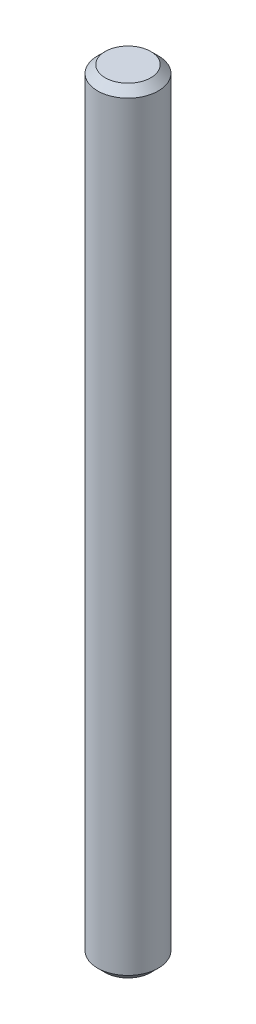
ISO-10303-21;
HEADER;
FILE_DESCRIPTION(('STEP AP214'),'2;1');
FILE_NAME('part.step','',(''),(''),'','','');
FILE_SCHEMA(('AUTOMOTIVE_DESIGN { 1 0 10303 214 1 1 1 1 }'));
ENDSEC;
DATA;
#1=APPLICATION_CONTEXT('core data for automotive mechanical design processes');
#2=APPLICATION_PROTOCOL_DEFINITION('international standard','automotive_design',2000,#1);
#3=PRODUCT_CONTEXT('',#1,'mechanical');
#4=PRODUCT('Part','Part','',(#3));
#5=PRODUCT_RELATED_PRODUCT_CATEGORY('part','',(#4));
#6=PRODUCT_DEFINITION_FORMATION('','',#4);
#7=PRODUCT_DEFINITION_CONTEXT('part definition',#1,'design');
#8=PRODUCT_DEFINITION('design','',#6,#7);
#9=PRODUCT_DEFINITION_SHAPE('','',#8);
#10=(LENGTH_UNIT() NAMED_UNIT(*) SI_UNIT(.MILLI.,.METRE.));
#11=(NAMED_UNIT(*) PLANE_ANGLE_UNIT() SI_UNIT($,.RADIAN.));
#12=(NAMED_UNIT(*) SI_UNIT($,.STERADIAN.) SOLID_ANGLE_UNIT());
#13=UNCERTAINTY_MEASURE_WITH_UNIT(LENGTH_MEASURE(1.E-05),#10,'distance_accuracy_value','');
#14=(GEOMETRIC_REPRESENTATION_CONTEXT(3) GLOBAL_UNCERTAINTY_ASSIGNED_CONTEXT((#13)) GLOBAL_UNIT_ASSIGNED_CONTEXT((#10,
#11,#12)) REPRESENTATION_CONTEXT('',''));
#15=CARTESIAN_POINT('',(0.,0.,0.));
#16=DIRECTION('',(0.,0.,1.));
#17=DIRECTION('',(1.,0.,0.));
#18=AXIS2_PLACEMENT_3D('',#15,#16,#17);
#19=CARTESIAN_POINT('',(0.567374904106787,51.,-0.59324877868801));
#20=DIRECTION('',(0.,-1.,0.));
#21=DIRECTION('',(0.,0.,-1.));
#22=AXIS2_PLACEMENT_3D('',#19,#20,#21);
#23=CYLINDRICAL_SURFACE('',#22,2.);
#24=CARTESIAN_POINT('',(0.567374904106787,0.499999999999994,-0.59324877868801));
#25=DIRECTION('',(0.,1.,0.));
#26=DIRECTION('',(0.,0.,1.));
#27=AXIS2_PLACEMENT_3D('',#24,#25,#26);
#28=CIRCLE('',#27,2.);
#29=CARTESIAN_POINT('',(0.567374904106787,0.499999999999994,1.40675122131199));
#30=VERTEX_POINT('',#29);
#31=EDGE_CURVE('E51',#30,#30,#28,.T.);
#32=ORIENTED_EDGE('',*,*,#31,.T.);
#33=EDGE_LOOP('',(#32));
#34=FACE_BOUND('',#33,.T.);
#35=CARTESIAN_POINT('',(0.567374904106787,50.5,-0.59324877868801));
#36=DIRECTION('',(0.,1.,0.));
#37=DIRECTION('',(0.,0.,1.));
#38=AXIS2_PLACEMENT_3D('',#35,#36,#37);
#39=CIRCLE('',#38,2.);
#40=CARTESIAN_POINT('',(0.567374904106787,50.5,1.40675122131199));
#41=VERTEX_POINT('',#40);
#42=EDGE_CURVE('E55',#41,#41,#39,.F.);
#43=ORIENTED_EDGE('',*,*,#42,.T.);
#44=EDGE_LOOP('',(#43));
#45=FACE_BOUND('',#44,.T.);
#46=ADVANCED_FACE('F40',(#34,#45),#23,.T.);
#47=CARTESIAN_POINT('',(0.567374904106787,51.,-0.59324877868801));
#48=DIRECTION('',(0.,1.,0.));
#49=DIRECTION('',(0.,0.,1.));
#50=AXIS2_PLACEMENT_3D('',#47,#48,#49);
#51=PLANE('',#50);
#52=CARTESIAN_POINT('',(0.567374904106787,51.,-0.59324877868801));
#53=DIRECTION('',(0.,1.,0.));
#54=DIRECTION('',(0.,0.,1.));
#55=AXIS2_PLACEMENT_3D('',#52,#53,#54);
#56=CIRCLE('',#55,1.50000000000001);
#57=CARTESIAN_POINT('',(0.567374904106787,51.,0.906751221311998));
#58=VERTEX_POINT('',#57);
#59=EDGE_CURVE('E10',#58,#58,#56,.T.);
#60=ORIENTED_EDGE('',*,*,#59,.T.);
#61=EDGE_LOOP('',(#60));
#62=FACE_BOUND('',#61,.T.);
#63=ADVANCED_FACE('F71',(#62),#51,.T.);
#64=CARTESIAN_POINT('',(0.567374904106787,0.,-0.59324877868801));
#65=DIRECTION('',(0.,1.,0.));
#66=DIRECTION('',(0.,0.,1.));
#67=AXIS2_PLACEMENT_3D('',#64,#65,#66);
#68=PLANE('',#67);
#69=CARTESIAN_POINT('',(0.567374904106787,0.,-0.59324877868801));
#70=DIRECTION('',(0.,1.,0.));
#71=DIRECTION('',(0.,0.,1.));
#72=AXIS2_PLACEMENT_3D('',#69,#70,#71);
#73=CIRCLE('',#72,1.5);
#74=CARTESIAN_POINT('',(0.567374904106787,0.,0.906751221311991));
#75=VERTEX_POINT('',#74);
#76=EDGE_CURVE('E47',#75,#75,#73,.F.);
#77=ORIENTED_EDGE('',*,*,#76,.T.);
#78=EDGE_LOOP('',(#77));
#79=FACE_BOUND('',#78,.T.);
#80=ADVANCED_FACE('F68',(#79),#68,.F.);
#81=CARTESIAN_POINT('',(0.567374904106787,0.499999999999994,-0.59324877868801));
#82=DIRECTION('',(0.,1.,0.));
#83=DIRECTION('',(0.,0.,1.));
#84=AXIS2_PLACEMENT_3D('',#81,#82,#83);
#85=CONICAL_SURFACE('',#84,2.,0.785398163397453);
#86=ORIENTED_EDGE('',*,*,#76,.F.);
#87=EDGE_LOOP('',(#86));
#88=FACE_BOUND('',#87,.T.);
#89=ORIENTED_EDGE('',*,*,#31,.F.);
#90=EDGE_LOOP('',(#89));
#91=FACE_BOUND('',#90,.T.);
#92=ADVANCED_FACE('F64',(#88,#91),#85,.T.);
#93=CARTESIAN_POINT('',(0.567374904106787,51.,-0.59324877868801));
#94=DIRECTION('',(0.,-1.,0.));
#95=DIRECTION('',(0.,0.,-1.));
#96=AXIS2_PLACEMENT_3D('',#93,#94,#95);
#97=CONICAL_SURFACE('',#96,1.50000000000001,0.78539816339744);
#98=ORIENTED_EDGE('',*,*,#42,.F.);
#99=EDGE_LOOP('',(#98));
#100=FACE_BOUND('',#99,.T.);
#101=ORIENTED_EDGE('',*,*,#59,.F.);
#102=EDGE_LOOP('',(#101));
#103=FACE_BOUND('',#102,.T.);
#104=ADVANCED_FACE('F42',(#100,#103),#97,.T.);
#105=CLOSED_SHELL('',(#46,#63,#80,#92,#104));
#106=MANIFOLD_SOLID_BREP('B2',#105);
#107=ADVANCED_BREP_SHAPE_REPRESENTATION('',(#18,#106),#14);
#108=SHAPE_DEFINITION_REPRESENTATION(#9,#107);
ENDSEC;
END-ISO-10303-21;
